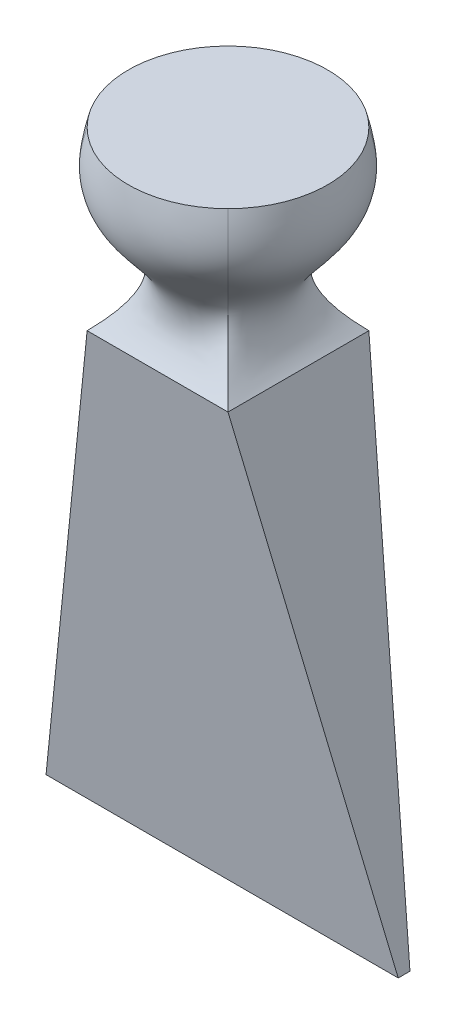
ISO-10303-21;
HEADER;
FILE_DESCRIPTION(('STEP AP214'),'2;1');
FILE_NAME('part.step','',(''),(''),'','','');
FILE_SCHEMA(('AUTOMOTIVE_DESIGN { 1 0 10303 214 1 1 1 1 }'));
ENDSEC;
DATA;
#1=APPLICATION_CONTEXT('core data for automotive mechanical design processes');
#2=APPLICATION_PROTOCOL_DEFINITION('international standard','automotive_design',2000,#1);
#3=PRODUCT_CONTEXT('',#1,'mechanical');
#4=PRODUCT('Part','Part','',(#3));
#5=PRODUCT_RELATED_PRODUCT_CATEGORY('part','',(#4));
#6=PRODUCT_DEFINITION_FORMATION('','',#4);
#7=PRODUCT_DEFINITION_CONTEXT('part definition',#1,'design');
#8=PRODUCT_DEFINITION('design','',#6,#7);
#9=PRODUCT_DEFINITION_SHAPE('','',#8);
#10=(LENGTH_UNIT() NAMED_UNIT(*) SI_UNIT(.MILLI.,.METRE.));
#11=(NAMED_UNIT(*) PLANE_ANGLE_UNIT() SI_UNIT($,.RADIAN.));
#12=(NAMED_UNIT(*) SI_UNIT($,.STERADIAN.) SOLID_ANGLE_UNIT());
#13=UNCERTAINTY_MEASURE_WITH_UNIT(LENGTH_MEASURE(1.E-05),#10,'distance_accuracy_value','');
#14=(GEOMETRIC_REPRESENTATION_CONTEXT(3) GLOBAL_UNCERTAINTY_ASSIGNED_CONTEXT((#13)) GLOBAL_UNIT_ASSIGNED_CONTEXT((#10,
#11,#12)) REPRESENTATION_CONTEXT('',''));
#15=CARTESIAN_POINT('',(0.,0.,0.));
#16=DIRECTION('',(0.,0.,1.));
#17=DIRECTION('',(1.,0.,0.));
#18=AXIS2_PLACEMENT_3D('',#15,#16,#17);
#19=CARTESIAN_POINT('',(0.,75.,0.));
#20=DIRECTION('',(0.,1.,0.));
#21=DIRECTION('',(0.,0.,1.));
#22=AXIS2_PLACEMENT_3D('',#19,#20,#21);
#23=PLANE('',#22);
#24=CARTESIAN_POINT('',(0.,75.,0.));
#25=DIRECTION('',(0.,1.,0.));
#26=DIRECTION('',(0.,0.,1.));
#27=AXIS2_PLACEMENT_3D('',#24,#25,#26);
#28=CIRCLE('',#27,42.43);
#29=CARTESIAN_POINT('',(-30.0025407257452,75.,30.0025407257452));
#30=VERTEX_POINT('',#29);
#31=CARTESIAN_POINT('',(30.0025407257452,75.,30.0025407257452));
#32=VERTEX_POINT('',#31);
#33=EDGE_CURVE('E12',#30,#32,#28,.T.);
#34=ORIENTED_EDGE('',*,*,#33,.T.);
#35=CARTESIAN_POINT('',(30.0025407257452,75.,-30.0025407257452));
#36=VERTEX_POINT('',#35);
#37=EDGE_CURVE('E87',#32,#36,#28,.T.);
#38=ORIENTED_EDGE('',*,*,#37,.T.);
#39=CARTESIAN_POINT('',(-30.0025407257452,75.,-30.0025407257452));
#40=VERTEX_POINT('',#39);
#41=EDGE_CURVE('E298',#36,#40,#28,.T.);
#42=ORIENTED_EDGE('',*,*,#41,.T.);
#43=EDGE_CURVE('E295',#40,#30,#28,.T.);
#44=ORIENTED_EDGE('',*,*,#43,.T.);
#45=EDGE_LOOP('',(#34,#38,#42,#44));
#46=FACE_BOUND('',#45,.T.);
#47=ADVANCED_FACE('F77',(#46),#23,.T.);
#48=CARTESIAN_POINT('',(30.,0.,30.));
#49=CARTESIAN_POINT('',(21.7846895866989,8.33375081186332,21.7846895866989));
#50=CARTESIAN_POINT('',(11.2329410043442,26.7206859017202,11.2329410043442));
#51=CARTESIAN_POINT('',(33.5195993402164,47.1325663606226,33.5195993402164));
#52=CARTESIAN_POINT('',(31.8341100329988,65.7637124347228,31.8341100329988));
#53=CARTESIAN_POINT('',(30.0025407257452,75.,30.0025407257452));
#54=CARTESIAN_POINT('',(30.,0.,10.));
#55=CARTESIAN_POINT('',(21.7846895866989,8.33375081186332,7.2615631955663));
#56=CARTESIAN_POINT('',(23.442005049713,26.7206859017202,6.28276669313681));
#57=CARTESIAN_POINT('',(51.1209581360602,47.1325663606226,14.8327941858167));
#58=CARTESIAN_POINT('',(48.3929625953667,65.7637124347228,14.0542112657952));
#59=CARTESIAN_POINT('',(46.5613932881131,75.,13.4436881633773));
#60=CARTESIAN_POINT('',(30.,0.,-10.));
#61=CARTESIAN_POINT('',(21.7846895866989,8.33375081186332,-7.2615631955663));
#62=CARTESIAN_POINT('',(23.442005049713,26.7206859017202,-6.28276669313682));
#63=CARTESIAN_POINT('',(51.1209581360602,47.1325663606226,-14.8327941858167));
#64=CARTESIAN_POINT('',(48.3929625953667,65.7637124347228,-14.0542112657952));
#65=CARTESIAN_POINT('',(46.5613932881131,75.,-13.4436881633773));
#66=CARTESIAN_POINT('',(30.,0.,-30.));
#67=CARTESIAN_POINT('',(21.7846895866989,8.33375081186332,-21.7846895866989));
#68=CARTESIAN_POINT('',(11.2329410043442,26.7206859017202,-11.2329410043442));
#69=CARTESIAN_POINT('',(33.5195993402164,47.1325663606226,-33.5195993402164));
#70=CARTESIAN_POINT('',(31.8341100329988,65.7637124347228,-31.8341100329988));
#71=CARTESIAN_POINT('',(30.0025407257452,75.,-30.0025407257452));
#72=B_SPLINE_SURFACE_WITH_KNOTS('',3,3,((#48,#49,#50,#51,#52,#53),(#54,#55,#56,#57,#58,#59),
(#60,#61,#62,#63,#64,#65),(#66,#67,#68,#69,#70,#71)),.UNSPECIFIED.,.F.,.F.,.F.,(4,4),(4,1,1,4),
(0.,1.),(0.,0.335302488158386,0.700458797580726,1.),.UNSPECIFIED.);
#73=DIRECTION('',(0.,0.,-1.));
#74=VECTOR('',#73,1.);
#75=CARTESIAN_POINT('',(30.,0.,-30.));
#76=LINE('',#75,#74);
#77=CARTESIAN_POINT('',(30.,0.,30.));
#78=VERTEX_POINT('',#77);
#79=CARTESIAN_POINT('',(30.,0.,-30.));
#80=VERTEX_POINT('',#79);
#81=EDGE_CURVE('E271',#78,#80,#76,.T.);
#82=CARTESIAN_POINT('',(30.,0.,-30.));
#83=CARTESIAN_POINT('',(21.7846895866989,8.33375081186332,-21.7846895866989));
#84=CARTESIAN_POINT('',(11.2329410043442,26.7206859017202,-11.2329410043442));
#85=CARTESIAN_POINT('',(33.5195993402164,47.1325663606226,-33.5195993402164));
#86=CARTESIAN_POINT('',(31.8341100329988,65.7637124347228,-31.8341100329988));
#87=CARTESIAN_POINT('',(30.0025407257452,75.,-30.0025407257452));
#88=B_SPLINE_CURVE_WITH_KNOTS('',3,(#82,#83,#84,#85,#86,#87),.UNSPECIFIED.,.F.,.F.,(4,1,1,4),
(0.,0.335302488158386,0.700458797580726,1.),.UNSPECIFIED.);
#89=EDGE_CURVE('E175',#80,#36,#88,.T.);
#90=CARTESIAN_POINT('',(30.,0.,30.));
#91=CARTESIAN_POINT('',(21.7846895866989,8.33375081186332,21.7846895866989));
#92=CARTESIAN_POINT('',(11.2329410043442,26.7206859017202,11.2329410043442));
#93=CARTESIAN_POINT('',(33.5195993402164,47.1325663606226,33.5195993402164));
#94=CARTESIAN_POINT('',(31.8341100329988,65.7637124347228,31.8341100329988));
#95=CARTESIAN_POINT('',(30.0025407257452,75.,30.0025407257452));
#96=B_SPLINE_CURVE_WITH_KNOTS('',3,(#90,#91,#92,#93,#94,#95),.UNSPECIFIED.,.F.,.F.,(4,1,1,4),
(0.,0.335302488158386,0.700458797580726,1.),.UNSPECIFIED.);
#97=EDGE_CURVE('E283',#32,#78,#96,.F.);
#98=ORIENTED_EDGE('',*,*,#81,.T.);
#99=ORIENTED_EDGE('',*,*,#89,.T.);
#100=ORIENTED_EDGE('',*,*,#37,.F.);
#101=ORIENTED_EDGE('',*,*,#97,.T.);
#102=EDGE_LOOP('',(#98,#99,#100,#101));
#103=FACE_BOUND('',#102,.T.);
#104=ADVANCED_FACE('F353',(#103),#72,.T.);
#105=CARTESIAN_POINT('',(30.,0.,-30.));
#106=CARTESIAN_POINT('',(21.7846895866989,8.33375081186332,-21.7846895866989));
#107=CARTESIAN_POINT('',(11.2329410043442,26.7206859017202,-11.2329410043442));
#108=CARTESIAN_POINT('',(33.5195993402164,47.1325663606226,-33.5195993402164));
#109=CARTESIAN_POINT('',(31.8341100329988,65.7637124347228,-31.8341100329988));
#110=CARTESIAN_POINT('',(30.0025407257452,75.,-30.0025407257452));
#111=CARTESIAN_POINT('',(10.,0.,-30.));
#112=CARTESIAN_POINT('',(7.2615631955663,8.33375081186332,-21.7846895866989));
#113=CARTESIAN_POINT('',(6.28276669313682,26.7206859017202,-23.442005049713));
#114=CARTESIAN_POINT('',(14.8327941858167,47.1325663606226,-51.1209581360602));
#115=CARTESIAN_POINT('',(14.0542112657952,65.7637124347228,-48.3929625953667));
#116=CARTESIAN_POINT('',(13.4436881633773,75.,-46.5613932881131));
#117=CARTESIAN_POINT('',(-10.,0.,-30.));
#118=CARTESIAN_POINT('',(-7.2615631955663,8.33375081186332,-21.7846895866989));
#119=CARTESIAN_POINT('',(-6.28276669313681,26.7206859017202,-23.442005049713));
#120=CARTESIAN_POINT('',(-14.8327941858167,47.1325663606226,-51.1209581360602));
#121=CARTESIAN_POINT('',(-14.0542112657952,65.7637124347228,-48.3929625953667));
#122=CARTESIAN_POINT('',(-13.4436881633773,75.,-46.5613932881131));
#123=CARTESIAN_POINT('',(-30.,0.,-30.));
#124=CARTESIAN_POINT('',(-21.7846895866989,8.33375081186332,-21.7846895866989));
#125=CARTESIAN_POINT('',(-11.2329410043442,26.7206859017202,-11.2329410043442));
#126=CARTESIAN_POINT('',(-33.5195993402164,47.1325663606226,-33.5195993402164));
#127=CARTESIAN_POINT('',(-31.8341100329988,65.7637124347228,-31.8341100329988));
#128=CARTESIAN_POINT('',(-30.0025407257452,75.,-30.0025407257452));
#129=B_SPLINE_SURFACE_WITH_KNOTS('',3,3,((#105,#106,#107,#108,#109,#110),(#111,#112,#113,#114,
#115,#116),(#117,#118,#119,#120,#121,#122),(#123,#124,#125,#126,#127,#128)),.UNSPECIFIED.,.F.,
.F.,.F.,(4,4),(4,1,1,4),(0.,1.),(0.,0.335302488158386,0.700458797580726,1.),.UNSPECIFIED.);
#130=DIRECTION('',(-1.,0.,0.));
#131=VECTOR('',#130,1.);
#132=CARTESIAN_POINT('',(30.,0.,-30.));
#133=LINE('',#132,#131);
#134=CARTESIAN_POINT('',(-30.,0.,-30.));
#135=VERTEX_POINT('',#134);
#136=EDGE_CURVE('E279',#80,#135,#133,.T.);
#137=CARTESIAN_POINT('',(-30.,0.,-30.));
#138=CARTESIAN_POINT('',(-21.7846895866989,8.33375081186332,-21.7846895866989));
#139=CARTESIAN_POINT('',(-11.2329410043442,26.7206859017202,-11.2329410043442));
#140=CARTESIAN_POINT('',(-33.5195993402164,47.1325663606226,-33.5195993402164));
#141=CARTESIAN_POINT('',(-31.8341100329988,65.7637124347228,-31.8341100329988));
#142=CARTESIAN_POINT('',(-30.0025407257452,75.,-30.0025407257452));
#143=B_SPLINE_CURVE_WITH_KNOTS('',3,(#137,#138,#139,#140,#141,#142),.UNSPECIFIED.,.F.,.F.,(4,1,
1,4),(0.,0.335302488158386,0.700458797580726,1.),.UNSPECIFIED.);
#144=EDGE_CURVE('E289',#135,#40,#143,.T.);
#145=ORIENTED_EDGE('',*,*,#136,.T.);
#146=ORIENTED_EDGE('',*,*,#144,.T.);
#147=ORIENTED_EDGE('',*,*,#41,.F.);
#148=ORIENTED_EDGE('',*,*,#89,.F.);
#149=EDGE_LOOP('',(#145,#146,#147,#148));
#150=FACE_BOUND('',#149,.T.);
#151=ADVANCED_FACE('F350',(#150),#129,.T.);
#152=CARTESIAN_POINT('',(-30.,0.,30.));
#153=CARTESIAN_POINT('',(-21.7846895866989,8.33375081186332,21.7846895866989));
#154=CARTESIAN_POINT('',(-11.2329410043442,26.7206859017202,11.2329410043442));
#155=CARTESIAN_POINT('',(-33.5195993402164,47.1325663606226,33.5195993402164));
#156=CARTESIAN_POINT('',(-31.8341100329988,65.7637124347228,31.8341100329988));
#157=CARTESIAN_POINT('',(-30.0025407257452,75.,30.0025407257452));
#158=CARTESIAN_POINT('',(-10.,0.,30.));
#159=CARTESIAN_POINT('',(-7.2615631955663,8.33375081186332,21.7846895866989));
#160=CARTESIAN_POINT('',(-6.28276669313682,26.7206859017202,23.442005049713));
#161=CARTESIAN_POINT('',(-14.8327941858167,47.1325663606226,51.1209581360602));
#162=CARTESIAN_POINT('',(-14.0542112657952,65.7637124347228,48.3929625953667));
#163=CARTESIAN_POINT('',(-13.4436881633773,75.,46.5613932881131));
#164=CARTESIAN_POINT('',(10.,0.,30.));
#165=CARTESIAN_POINT('',(7.2615631955663,8.33375081186332,21.7846895866989));
#166=CARTESIAN_POINT('',(6.28276669313681,26.7206859017202,23.442005049713));
#167=CARTESIAN_POINT('',(14.8327941858167,47.1325663606226,51.1209581360602));
#168=CARTESIAN_POINT('',(14.0542112657952,65.7637124347228,48.3929625953667));
#169=CARTESIAN_POINT('',(13.4436881633773,75.,46.5613932881131));
#170=CARTESIAN_POINT('',(30.,0.,30.));
#171=CARTESIAN_POINT('',(21.7846895866989,8.33375081186332,21.7846895866989));
#172=CARTESIAN_POINT('',(11.2329410043442,26.7206859017202,11.2329410043442));
#173=CARTESIAN_POINT('',(33.5195993402164,47.1325663606226,33.5195993402164));
#174=CARTESIAN_POINT('',(31.8341100329988,65.7637124347228,31.8341100329988));
#175=CARTESIAN_POINT('',(30.0025407257452,75.,30.0025407257452));
#176=B_SPLINE_SURFACE_WITH_KNOTS('',3,3,((#152,#153,#154,#155,#156,#157),(#158,#159,#160,#161,
#162,#163),(#164,#165,#166,#167,#168,#169),(#170,#171,#172,#173,#174,#175)),.UNSPECIFIED.,.F.,
.F.,.F.,(4,4),(4,1,1,4),(0.,1.),(0.,0.335302488158386,0.700458797580726,1.),.UNSPECIFIED.);
#177=DIRECTION('',(1.,0.,0.));
#178=VECTOR('',#177,1.);
#179=CARTESIAN_POINT('',(30.,0.,30.));
#180=LINE('',#179,#178);
#181=CARTESIAN_POINT('',(-30.,0.,30.));
#182=VERTEX_POINT('',#181);
#183=EDGE_CURVE('E274',#182,#78,#180,.T.);
#184=CARTESIAN_POINT('',(-30.,0.,30.));
#185=CARTESIAN_POINT('',(-21.7846895866989,8.33375081186332,21.7846895866989));
#186=CARTESIAN_POINT('',(-11.2329410043442,26.7206859017202,11.2329410043442));
#187=CARTESIAN_POINT('',(-33.5195993402164,47.1325663606226,33.5195993402164));
#188=CARTESIAN_POINT('',(-31.8341100329988,65.7637124347228,31.8341100329988));
#189=CARTESIAN_POINT('',(-30.0025407257452,75.,30.0025407257452));
#190=B_SPLINE_CURVE_WITH_KNOTS('',3,(#184,#185,#186,#187,#188,#189),.UNSPECIFIED.,.F.,.F.,(4,1,
1,4),(0.,0.335302488158386,0.700458797580726,1.),.UNSPECIFIED.);
#191=EDGE_CURVE('E292',#182,#30,#190,.T.);
#192=ORIENTED_EDGE('',*,*,#183,.T.);
#193=ORIENTED_EDGE('',*,*,#97,.F.);
#194=ORIENTED_EDGE('',*,*,#33,.F.);
#195=ORIENTED_EDGE('',*,*,#191,.F.);
#196=EDGE_LOOP('',(#192,#193,#194,#195));
#197=FACE_BOUND('',#196,.T.);
#198=ADVANCED_FACE('F357',(#197),#176,.T.);
#199=CARTESIAN_POINT('',(-30.,0.,-30.));
#200=CARTESIAN_POINT('',(-21.7846895866989,8.33375081186332,-21.7846895866989));
#201=CARTESIAN_POINT('',(-11.2329410043442,26.7206859017202,-11.2329410043442));
#202=CARTESIAN_POINT('',(-33.5195993402164,47.1325663606226,-33.5195993402164));
#203=CARTESIAN_POINT('',(-31.8341100329988,65.7637124347228,-31.8341100329988));
#204=CARTESIAN_POINT('',(-30.0025407257452,75.,-30.0025407257452));
#205=CARTESIAN_POINT('',(-30.,0.,-10.));
#206=CARTESIAN_POINT('',(-21.7846895866989,8.33375081186332,-7.2615631955663));
#207=CARTESIAN_POINT('',(-23.442005049713,26.7206859017202,-6.28276669313682));
#208=CARTESIAN_POINT('',(-51.1209581360602,47.1325663606226,-14.8327941858167));
#209=CARTESIAN_POINT('',(-48.3929625953667,65.7637124347228,-14.0542112657952));
#210=CARTESIAN_POINT('',(-46.5613932881131,75.,-13.4436881633773));
#211=CARTESIAN_POINT('',(-30.,0.,10.));
#212=CARTESIAN_POINT('',(-21.7846895866989,8.33375081186332,7.2615631955663));
#213=CARTESIAN_POINT('',(-23.442005049713,26.7206859017202,6.28276669313681));
#214=CARTESIAN_POINT('',(-51.1209581360602,47.1325663606226,14.8327941858167));
#215=CARTESIAN_POINT('',(-48.3929625953667,65.7637124347228,14.0542112657952));
#216=CARTESIAN_POINT('',(-46.5613932881131,75.,13.4436881633773));
#217=CARTESIAN_POINT('',(-30.,0.,30.));
#218=CARTESIAN_POINT('',(-21.7846895866989,8.33375081186332,21.7846895866989));
#219=CARTESIAN_POINT('',(-11.2329410043442,26.7206859017202,11.2329410043442));
#220=CARTESIAN_POINT('',(-33.5195993402164,47.1325663606226,33.5195993402164));
#221=CARTESIAN_POINT('',(-31.8341100329988,65.7637124347228,31.8341100329988));
#222=CARTESIAN_POINT('',(-30.0025407257452,75.,30.0025407257452));
#223=B_SPLINE_SURFACE_WITH_KNOTS('',3,3,((#199,#200,#201,#202,#203,#204),(#205,#206,#207,#208,
#209,#210),(#211,#212,#213,#214,#215,#216),(#217,#218,#219,#220,#221,#222)),.UNSPECIFIED.,.F.,
.F.,.F.,(4,4),(4,1,1,4),(0.,1.),(0.,0.335302488158386,0.700458797580726,1.),.UNSPECIFIED.);
#224=DIRECTION('',(0.,0.,1.));
#225=VECTOR('',#224,1.);
#226=CARTESIAN_POINT('',(-30.,0.,-30.));
#227=LINE('',#226,#225);
#228=EDGE_CURVE('E140',#135,#182,#227,.T.);
#229=ORIENTED_EDGE('',*,*,#228,.T.);
#230=ORIENTED_EDGE('',*,*,#191,.T.);
#231=ORIENTED_EDGE('',*,*,#43,.F.);
#232=ORIENTED_EDGE('',*,*,#144,.F.);
#233=EDGE_LOOP('',(#229,#230,#231,#232));
#234=FACE_BOUND('',#233,.T.);
#235=ADVANCED_FACE('F185',(#234),#223,.T.);
#236=CARTESIAN_POINT('',(0.,-200.,0.));
#237=DIRECTION('',(0.,1.,0.));
#238=DIRECTION('',(0.,0.,1.));
#239=AXIS2_PLACEMENT_3D('',#236,#237,#238);
#240=PLANE('',#239);
#241=DIRECTION('',(0.,0.,1.));
#242=VECTOR('',#241,1.);
#243=CARTESIAN_POINT('',(-75.,-200.,-2.5));
#244=LINE('',#243,#242);
#245=CARTESIAN_POINT('',(-75.,-200.,-2.5));
#246=VERTEX_POINT('',#245);
#247=CARTESIAN_POINT('',(-75.,-200.,2.5));
#248=VERTEX_POINT('',#247);
#249=EDGE_CURVE('E136',#246,#248,#244,.T.);
#250=ORIENTED_EDGE('',*,*,#249,.F.);
#251=DIRECTION('',(-1.,0.,0.));
#252=VECTOR('',#251,1.);
#253=CARTESIAN_POINT('',(-75.,-200.,-2.5));
#254=LINE('',#253,#252);
#255=CARTESIAN_POINT('',(75.,-200.,-2.5));
#256=VERTEX_POINT('',#255);
#257=EDGE_CURVE('E145',#256,#246,#254,.T.);
#258=ORIENTED_EDGE('',*,*,#257,.F.);
#259=DIRECTION('',(0.,0.,-1.));
#260=VECTOR('',#259,1.);
#261=CARTESIAN_POINT('',(75.,-200.,-2.5));
#262=LINE('',#261,#260);
#263=CARTESIAN_POINT('',(75.,-200.,2.5));
#264=VERTEX_POINT('',#263);
#265=EDGE_CURVE('E156',#264,#256,#262,.T.);
#266=ORIENTED_EDGE('',*,*,#265,.F.);
#267=DIRECTION('',(1.,0.,0.));
#268=VECTOR('',#267,1.);
#269=CARTESIAN_POINT('',(-75.,-200.,2.5));
#270=LINE('',#269,#268);
#271=EDGE_CURVE('E163',#248,#264,#270,.T.);
#272=ORIENTED_EDGE('',*,*,#271,.F.);
#273=EDGE_LOOP('',(#250,#258,#266,#272));
#274=FACE_BOUND('',#273,.T.);
#275=ADVANCED_FACE('F161',(#274),#240,.F.);
#276=CARTESIAN_POINT('',(-28.5544318857823,6.42474717430101,0.));
#277=DIRECTION('',(-0.975609756097561,0.219512195121951,0.));
#278=DIRECTION('',(-0.219512195121951,-0.975609756097561,0.));
#279=AXIS2_PLACEMENT_3D('',#276,#277,#278);
#280=PLANE('',#279);
#281=DIRECTION('',(-0.217563370783763,-0.966948314594504,0.132955393256744));
#282=VECTOR('',#281,1.);
#283=CARTESIAN_POINT('',(-30.,0.,-30.));
#284=LINE('',#283,#282);
#285=EDGE_CURVE('E131',#135,#246,#284,.T.);
#286=ORIENTED_EDGE('',*,*,#285,.T.);
#287=ORIENTED_EDGE('',*,*,#249,.T.);
#288=DIRECTION('',(-0.217563370783763,-0.966948314594504,-0.132955393256744));
#289=VECTOR('',#288,1.);
#290=CARTESIAN_POINT('',(-30.,0.,30.));
#291=LINE('',#290,#289);
#292=EDGE_CURVE('E144',#182,#248,#291,.T.);
#293=ORIENTED_EDGE('',*,*,#292,.F.);
#294=ORIENTED_EDGE('',*,*,#228,.F.);
#295=EDGE_LOOP('',(#286,#287,#293,#294));
#296=FACE_BOUND('',#295,.T.);
#297=ADVANCED_FACE('F133',(#296),#280,.T.);
#298=CARTESIAN_POINT('',(0.,-4.04845882533354,29.4433369115166));
#299=DIRECTION('',(0.,-0.136218340478728,0.990678839845296));
#300=DIRECTION('',(0.,-0.990678839845296,-0.136218340478728));
#301=AXIS2_PLACEMENT_3D('',#298,#299,#300);
#302=PLANE('',#301);
#303=ORIENTED_EDGE('',*,*,#292,.T.);
#304=ORIENTED_EDGE('',*,*,#271,.T.);
#305=DIRECTION('',(0.217563370783763,-0.966948314594504,-0.132955393256744));
#306=VECTOR('',#305,1.);
#307=CARTESIAN_POINT('',(30.,0.,30.));
#308=LINE('',#307,#306);
#309=EDGE_CURVE('E262',#78,#264,#308,.T.);
#310=ORIENTED_EDGE('',*,*,#309,.F.);
#311=ORIENTED_EDGE('',*,*,#183,.F.);
#312=EDGE_LOOP('',(#303,#304,#310,#311));
#313=FACE_BOUND('',#312,.T.);
#314=ADVANCED_FACE('F227',(#313),#302,.T.);
#315=CARTESIAN_POINT('',(0.,-4.04845882533354,-29.4433369115166));
#316=DIRECTION('',(0.,-0.136218340478728,-0.990678839845296));
#317=DIRECTION('',(0.,0.990678839845296,-0.136218340478728));
#318=AXIS2_PLACEMENT_3D('',#315,#316,#317);
#319=PLANE('',#318);
#320=DIRECTION('',(0.217563370783763,-0.966948314594504,0.132955393256744));
#321=VECTOR('',#320,1.);
#322=CARTESIAN_POINT('',(30.,0.,-30.));
#323=LINE('',#322,#321);
#324=EDGE_CURVE('E151',#80,#256,#323,.T.);
#325=ORIENTED_EDGE('',*,*,#324,.T.);
#326=ORIENTED_EDGE('',*,*,#257,.T.);
#327=ORIENTED_EDGE('',*,*,#285,.F.);
#328=ORIENTED_EDGE('',*,*,#136,.F.);
#329=EDGE_LOOP('',(#325,#326,#327,#328));
#330=FACE_BOUND('',#329,.T.);
#331=ADVANCED_FACE('F149',(#330),#319,.T.);
#332=CARTESIAN_POINT('',(28.5544318857823,6.42474717430101,0.));
#333=DIRECTION('',(0.975609756097561,0.219512195121951,0.));
#334=DIRECTION('',(-0.219512195121951,0.975609756097561,0.));
#335=AXIS2_PLACEMENT_3D('',#332,#333,#334);
#336=PLANE('',#335);
#337=ORIENTED_EDGE('',*,*,#309,.T.);
#338=ORIENTED_EDGE('',*,*,#265,.T.);
#339=ORIENTED_EDGE('',*,*,#324,.F.);
#340=ORIENTED_EDGE('',*,*,#81,.F.);
#341=EDGE_LOOP('',(#337,#338,#339,#340));
#342=FACE_BOUND('',#341,.T.);
#343=ADVANCED_FACE('F240',(#342),#336,.T.);
#344=CLOSED_SHELL('',(#47,#104,#151,#198,#235,#275,#297,#314,#331,#343));
#345=MANIFOLD_SOLID_BREP('B2',#344);
#346=ADVANCED_BREP_SHAPE_REPRESENTATION('',(#18,#345),#14);
#347=SHAPE_DEFINITION_REPRESENTATION(#9,#346);
ENDSEC;
END-ISO-10303-21;
